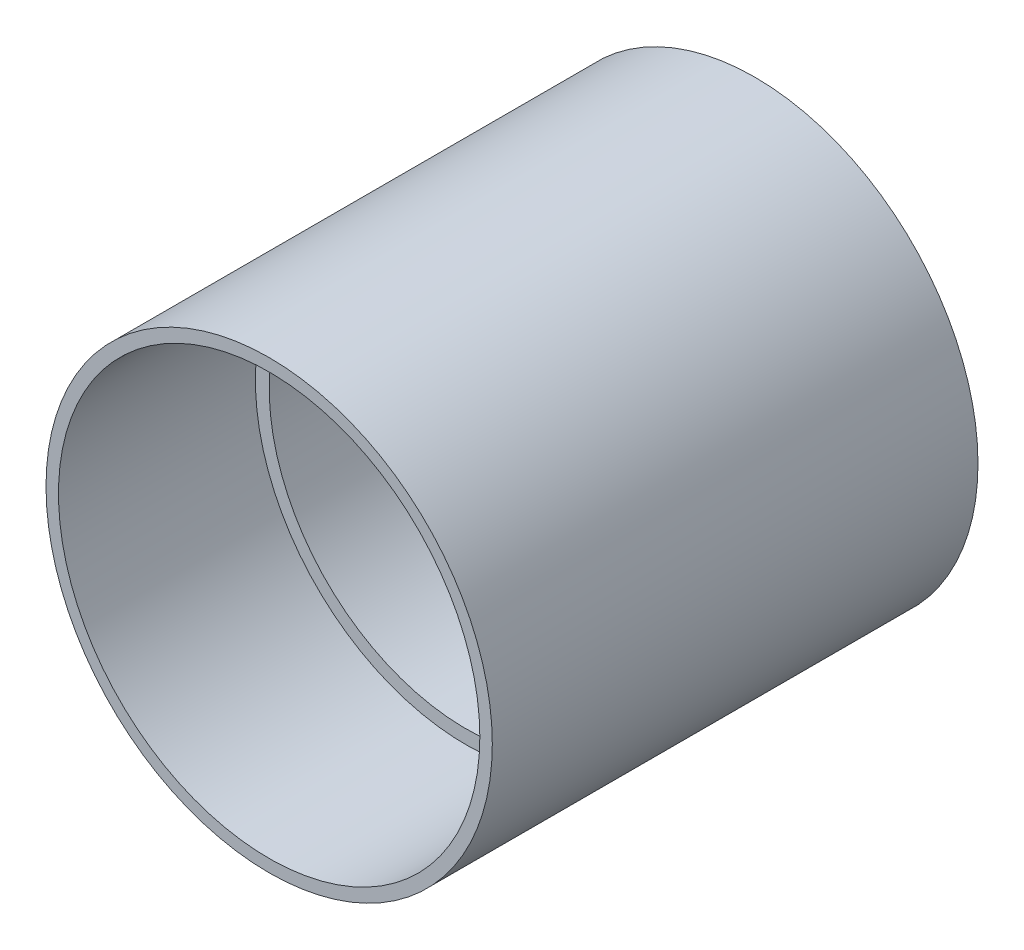
ISO-10303-21;
HEADER;
FILE_DESCRIPTION(('STEP AP214'),'2;1');
FILE_NAME('part.step','',(''),(''),'','','');
FILE_SCHEMA(('AUTOMOTIVE_DESIGN { 1 0 10303 214 1 1 1 1 }'));
ENDSEC;
DATA;
#1=APPLICATION_CONTEXT('core data for automotive mechanical design processes');
#2=APPLICATION_PROTOCOL_DEFINITION('international standard','automotive_design',2000,#1);
#3=PRODUCT_CONTEXT('',#1,'mechanical');
#4=PRODUCT('Part','Part','',(#3));
#5=PRODUCT_RELATED_PRODUCT_CATEGORY('part','',(#4));
#6=PRODUCT_DEFINITION_FORMATION('','',#4);
#7=PRODUCT_DEFINITION_CONTEXT('part definition',#1,'design');
#8=PRODUCT_DEFINITION('design','',#6,#7);
#9=PRODUCT_DEFINITION_SHAPE('','',#8);
#10=(LENGTH_UNIT() NAMED_UNIT(*) SI_UNIT(.MILLI.,.METRE.));
#11=(NAMED_UNIT(*) PLANE_ANGLE_UNIT() SI_UNIT($,.RADIAN.));
#12=(NAMED_UNIT(*) SI_UNIT($,.STERADIAN.) SOLID_ANGLE_UNIT());
#13=UNCERTAINTY_MEASURE_WITH_UNIT(LENGTH_MEASURE(1.E-05),#10,'distance_accuracy_value','');
#14=(GEOMETRIC_REPRESENTATION_CONTEXT(3) GLOBAL_UNCERTAINTY_ASSIGNED_CONTEXT((#13)) GLOBAL_UNIT_ASSIGNED_CONTEXT((#10,
#11,#12)) REPRESENTATION_CONTEXT('',''));
#15=CARTESIAN_POINT('',(0.,0.,0.));
#16=DIRECTION('',(0.,0.,1.));
#17=DIRECTION('',(1.,0.,0.));
#18=AXIS2_PLACEMENT_3D('',#15,#16,#17);
#19=CARTESIAN_POINT('',(0.,0.,74.));
#20=DIRECTION('',(0.,0.,-1.));
#21=DIRECTION('',(-1.,0.,0.));
#22=AXIS2_PLACEMENT_3D('',#19,#20,#21);
#23=CYLINDRICAL_SURFACE('',#22,34.);
#24=CARTESIAN_POINT('',(0.,0.,74.));
#25=DIRECTION('',(0.,0.,1.));
#26=DIRECTION('',(1.,0.,0.));
#27=AXIS2_PLACEMENT_3D('',#24,#25,#26);
#28=CIRCLE('',#27,34.);
#29=CARTESIAN_POINT('',(34.,0.,74.));
#30=VERTEX_POINT('',#29);
#31=EDGE_CURVE('E55',#30,#30,#28,.T.);
#32=ORIENTED_EDGE('',*,*,#31,.F.);
#33=EDGE_LOOP('',(#32));
#34=FACE_BOUND('',#33,.T.);
#35=CARTESIAN_POINT('',(0.,0.,0.));
#36=DIRECTION('',(0.,0.,1.));
#37=DIRECTION('',(1.,0.,0.));
#38=AXIS2_PLACEMENT_3D('',#35,#36,#37);
#39=CIRCLE('',#38,34.);
#40=CARTESIAN_POINT('',(34.,0.,0.));
#41=VERTEX_POINT('',#40);
#42=EDGE_CURVE('E61',#41,#41,#39,.T.);
#43=ORIENTED_EDGE('',*,*,#42,.T.);
#44=EDGE_LOOP('',(#43));
#45=FACE_BOUND('',#44,.T.);
#46=ADVANCED_FACE('F41',(#34,#45),#23,.T.);
#47=CARTESIAN_POINT('',(0.,0.,74.));
#48=DIRECTION('',(0.,0.,1.));
#49=DIRECTION('',(1.,0.,0.));
#50=AXIS2_PLACEMENT_3D('',#47,#48,#49);
#51=PLANE('',#50);
#52=CARTESIAN_POINT('',(0.,0.,74.));
#53=DIRECTION('',(0.,0.,1.));
#54=DIRECTION('',(1.,0.,0.));
#55=AXIS2_PLACEMENT_3D('',#52,#53,#54);
#56=CIRCLE('',#55,32.1);
#57=CARTESIAN_POINT('',(32.1,0.,74.));
#58=VERTEX_POINT('',#57);
#59=EDGE_CURVE('E66',#58,#58,#56,.T.);
#60=ORIENTED_EDGE('',*,*,#59,.F.);
#61=EDGE_LOOP('',(#60));
#62=FACE_BOUND('',#61,.T.);
#63=ORIENTED_EDGE('',*,*,#31,.T.);
#64=EDGE_LOOP('',(#63));
#65=FACE_BOUND('',#64,.T.);
#66=ADVANCED_FACE('F98',(#62,#65),#51,.T.);
#67=CARTESIAN_POINT('',(0.,0.,0.));
#68=DIRECTION('',(0.,0.,1.));
#69=DIRECTION('',(1.,0.,0.));
#70=AXIS2_PLACEMENT_3D('',#67,#68,#69);
#71=PLANE('',#70);
#72=ORIENTED_EDGE('',*,*,#42,.F.);
#73=EDGE_LOOP('',(#72));
#74=FACE_BOUND('',#73,.T.);
#75=ADVANCED_FACE('F91',(#74),#71,.F.);
#76=CARTESIAN_POINT('',(0.,0.,74.));
#77=DIRECTION('',(0.,0.,-1.));
#78=DIRECTION('',(-1.,0.,0.));
#79=AXIS2_PLACEMENT_3D('',#76,#77,#78);
#80=CYLINDRICAL_SURFACE('',#79,32.1);
#81=ORIENTED_EDGE('',*,*,#59,.T.);
#82=EDGE_LOOP('',(#81));
#83=FACE_BOUND('',#82,.T.);
#84=CARTESIAN_POINT('',(0.,0.,44.));
#85=DIRECTION('',(0.,0.,1.));
#86=DIRECTION('',(1.,0.,0.));
#87=AXIS2_PLACEMENT_3D('',#84,#85,#86);
#88=CIRCLE('',#87,32.1);
#89=CARTESIAN_POINT('',(32.1,0.,44.));
#90=VERTEX_POINT('',#89);
#91=EDGE_CURVE('E68',#90,#90,#88,.T.);
#92=ORIENTED_EDGE('',*,*,#91,.F.);
#93=EDGE_LOOP('',(#92));
#94=FACE_BOUND('',#93,.T.);
#95=ADVANCED_FACE('F86',(#83,#94),#80,.F.);
#96=CARTESIAN_POINT('',(0.,0.,44.));
#97=DIRECTION('',(0.,0.,1.));
#98=DIRECTION('',(1.,0.,0.));
#99=AXIS2_PLACEMENT_3D('',#96,#97,#98);
#100=PLANE('',#99);
#101=CARTESIAN_POINT('',(0.,0.,44.));
#102=DIRECTION('',(0.,0.,1.));
#103=DIRECTION('',(1.,0.,0.));
#104=AXIS2_PLACEMENT_3D('',#101,#102,#103);
#105=CIRCLE('',#104,30.);
#106=CARTESIAN_POINT('',(30.,0.,44.));
#107=VERTEX_POINT('',#106);
#108=EDGE_CURVE('E72',#107,#107,#105,.T.);
#109=ORIENTED_EDGE('',*,*,#108,.F.);
#110=EDGE_LOOP('',(#109));
#111=FACE_BOUND('',#110,.T.);
#112=ORIENTED_EDGE('',*,*,#91,.T.);
#113=EDGE_LOOP('',(#112));
#114=FACE_BOUND('',#113,.T.);
#115=ADVANCED_FACE('F83',(#111,#114),#100,.T.);
#116=CARTESIAN_POINT('',(0.,0.,44.));
#117=DIRECTION('',(0.,0.,-1.));
#118=DIRECTION('',(-1.,0.,0.));
#119=AXIS2_PLACEMENT_3D('',#116,#117,#118);
#120=CYLINDRICAL_SURFACE('',#119,30.);
#121=CARTESIAN_POINT('',(0.,0.,6.));
#122=DIRECTION('',(0.,0.,1.));
#123=DIRECTION('',(1.,0.,0.));
#124=AXIS2_PLACEMENT_3D('',#121,#122,#123);
#125=CIRCLE('',#124,30.);
#126=CARTESIAN_POINT('',(30.,0.,6.));
#127=VERTEX_POINT('',#126);
#128=EDGE_CURVE('E10',#127,#127,#125,.F.);
#129=ORIENTED_EDGE('',*,*,#128,.T.);
#130=EDGE_LOOP('',(#129));
#131=FACE_BOUND('',#130,.T.);
#132=ORIENTED_EDGE('',*,*,#108,.T.);
#133=EDGE_LOOP('',(#132));
#134=FACE_BOUND('',#133,.T.);
#135=ADVANCED_FACE('F81',(#131,#134),#120,.F.);
#136=CARTESIAN_POINT('',(0.,0.,4.));
#137=DIRECTION('',(0.,0.,1.));
#138=DIRECTION('',(1.,0.,0.));
#139=AXIS2_PLACEMENT_3D('',#136,#137,#138);
#140=PLANE('',#139);
#141=CARTESIAN_POINT('',(0.,0.,4.));
#142=DIRECTION('',(0.,0.,1.));
#143=DIRECTION('',(1.,0.,0.));
#144=AXIS2_PLACEMENT_3D('',#141,#142,#143);
#145=CIRCLE('',#144,28.);
#146=CARTESIAN_POINT('',(28.,0.,4.));
#147=VERTEX_POINT('',#146);
#148=EDGE_CURVE('E49',#147,#147,#145,.T.);
#149=ORIENTED_EDGE('',*,*,#148,.T.);
#150=EDGE_LOOP('',(#149));
#151=FACE_BOUND('',#150,.T.);
#152=ADVANCED_FACE('F139',(#151),#140,.T.);
#153=CARTESIAN_POINT('',(0.,0.,6.));
#154=DIRECTION('',(0.,0.,1.));
#155=DIRECTION('',(1.,0.,0.));
#156=AXIS2_PLACEMENT_3D('',#153,#154,#155);
#157=TOROIDAL_SURFACE('',#156,28.,2.);
#158=ORIENTED_EDGE('',*,*,#128,.F.);
#159=EDGE_LOOP('',(#158));
#160=FACE_BOUND('',#159,.T.);
#161=ORIENTED_EDGE('',*,*,#148,.F.);
#162=EDGE_LOOP('',(#161));
#163=FACE_BOUND('',#162,.T.);
#164=ADVANCED_FACE('F43',(#160,#163),#157,.F.);
#165=CLOSED_SHELL('',(#46,#66,#75,#95,#115,#135,#152,#164));
#166=MANIFOLD_SOLID_BREP('B2',#165);
#167=ADVANCED_BREP_SHAPE_REPRESENTATION('',(#18,#166),#14);
#168=SHAPE_DEFINITION_REPRESENTATION(#9,#167);
ENDSEC;
END-ISO-10303-21;
